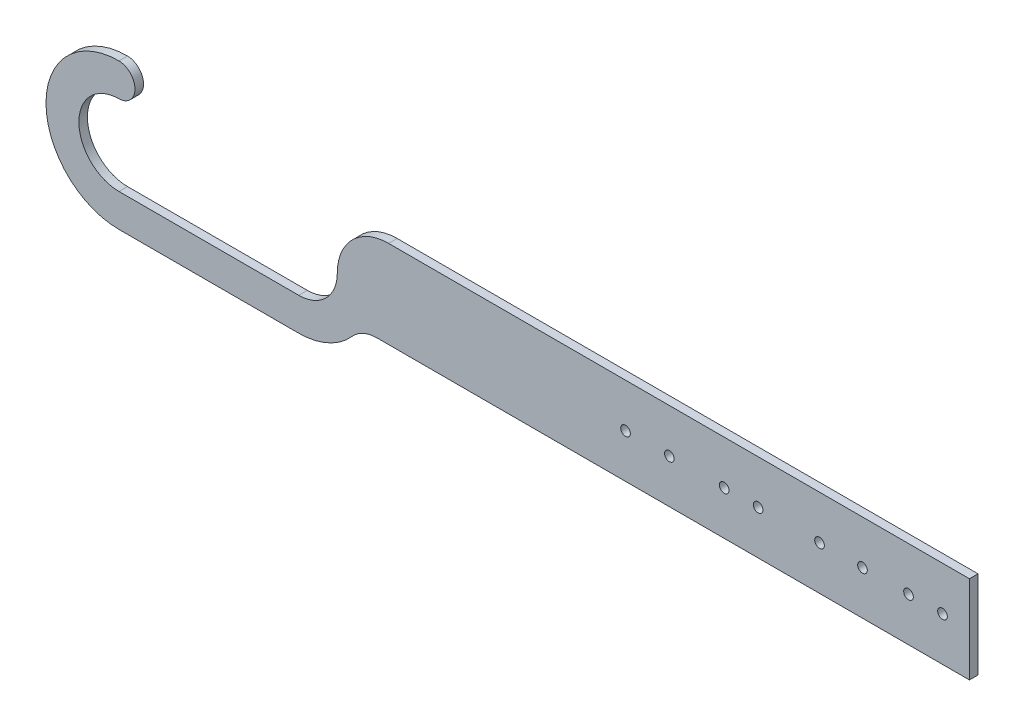
ISO-10303-21;
HEADER;
FILE_DESCRIPTION(('STEP AP214'),'2;1');
FILE_NAME('part.step','',(''),(''),'','','');
FILE_SCHEMA(('AUTOMOTIVE_DESIGN { 1 0 10303 214 1 1 1 1 }'));
ENDSEC;
DATA;
#1=APPLICATION_CONTEXT('core data for automotive mechanical design processes');
#2=APPLICATION_PROTOCOL_DEFINITION('international standard','automotive_design',2000,#1);
#3=PRODUCT_CONTEXT('',#1,'mechanical');
#4=PRODUCT('Part','Part','',(#3));
#5=PRODUCT_RELATED_PRODUCT_CATEGORY('part','',(#4));
#6=PRODUCT_DEFINITION_FORMATION('','',#4);
#7=PRODUCT_DEFINITION_CONTEXT('part definition',#1,'design');
#8=PRODUCT_DEFINITION('design','',#6,#7);
#9=PRODUCT_DEFINITION_SHAPE('','',#8);
#10=(LENGTH_UNIT() NAMED_UNIT(*) SI_UNIT(.MILLI.,.METRE.));
#11=(NAMED_UNIT(*) PLANE_ANGLE_UNIT() SI_UNIT($,.RADIAN.));
#12=(NAMED_UNIT(*) SI_UNIT($,.STERADIAN.) SOLID_ANGLE_UNIT());
#13=UNCERTAINTY_MEASURE_WITH_UNIT(LENGTH_MEASURE(1.E-05),#10,'distance_accuracy_value','');
#14=(GEOMETRIC_REPRESENTATION_CONTEXT(3) GLOBAL_UNCERTAINTY_ASSIGNED_CONTEXT((#13)) GLOBAL_UNIT_ASSIGNED_CONTEXT((#10,
#11,#12)) REPRESENTATION_CONTEXT('',''));
#15=CARTESIAN_POINT('',(0.,0.,0.));
#16=DIRECTION('',(0.,0.,1.));
#17=DIRECTION('',(1.,0.,0.));
#18=AXIS2_PLACEMENT_3D('',#15,#16,#17);
#19=CARTESIAN_POINT('',(0.,-12.5655772297577,4.953));
#20=DIRECTION('',(0.,-1.,0.));
#21=DIRECTION('',(1.,0.,0.));
#22=AXIS2_PLACEMENT_3D('',#19,#20,#21);
#23=PLANE('',#22);
#24=DIRECTION('',(0.,0.,-1.));
#25=VECTOR('',#24,1.);
#26=CARTESIAN_POINT('',(-48.3700595149993,-12.5655772297577,4.953));
#27=LINE('',#26,#25);
#28=CARTESIAN_POINT('',(-48.3700595149993,-12.5655772297577,4.953));
#29=VERTEX_POINT('',#28);
#30=CARTESIAN_POINT('',(-48.3700595149993,-12.5655772297577,0.));
#31=VERTEX_POINT('',#30);
#32=EDGE_CURVE('E63',#29,#31,#27,.T.);
#33=ORIENTED_EDGE('',*,*,#32,.T.);
#34=DIRECTION('',(-1.,0.,0.));
#35=VECTOR('',#34,1.);
#36=CARTESIAN_POINT('',(0.,-12.5655772297577,0.));
#37=LINE('',#36,#35);
#38=CARTESIAN_POINT('',(295.040794507666,-12.5655772297577,0.));
#39=VERTEX_POINT('',#38);
#40=EDGE_CURVE('E216',#39,#31,#37,.T.);
#41=ORIENTED_EDGE('',*,*,#40,.F.);
#42=DIRECTION('',(0.,0.,-1.));
#43=VECTOR('',#42,1.);
#44=CARTESIAN_POINT('',(295.040794507666,-12.5655772297577,4.953));
#45=LINE('',#44,#43);
#46=CARTESIAN_POINT('',(295.040794507666,-12.5655772297577,4.953));
#47=VERTEX_POINT('',#46);
#48=EDGE_CURVE('E11',#47,#39,#45,.T.);
#49=ORIENTED_EDGE('',*,*,#48,.F.);
#50=DIRECTION('',(-1.,0.,0.));
#51=VECTOR('',#50,1.);
#52=CARTESIAN_POINT('',(0.,-12.5655772297577,4.953));
#53=LINE('',#52,#51);
#54=EDGE_CURVE('E56',#47,#29,#53,.T.);
#55=ORIENTED_EDGE('',*,*,#54,.T.);
#56=EDGE_LOOP('',(#33,#41,#49,#55));
#57=FACE_BOUND('',#56,.T.);
#58=ADVANCED_FACE('F39',(#57),#23,.T.);
#59=CARTESIAN_POINT('',(295.040794507666,0.,4.953));
#60=DIRECTION('',(1.,0.,0.));
#61=DIRECTION('',(0.,0.,-1.));
#62=AXIS2_PLACEMENT_3D('',#59,#60,#61);
#63=PLANE('',#62);
#64=DIRECTION('',(0.,-1.,0.));
#65=VECTOR('',#64,1.);
#66=CARTESIAN_POINT('',(295.040794507666,0.,0.));
#67=LINE('',#66,#65);
#68=CARTESIAN_POINT('',(295.040794507666,38.2344227702423,0.));
#69=VERTEX_POINT('',#68);
#70=EDGE_CURVE('E250',#69,#39,#67,.T.);
#71=ORIENTED_EDGE('',*,*,#70,.F.);
#72=DIRECTION('',(0.,0.,-1.));
#73=VECTOR('',#72,1.);
#74=CARTESIAN_POINT('',(295.040794507666,38.2344227702423,4.953));
#75=LINE('',#74,#73);
#76=CARTESIAN_POINT('',(295.040794507666,38.2344227702423,4.953));
#77=VERTEX_POINT('',#76);
#78=EDGE_CURVE('E46',#77,#69,#75,.T.);
#79=ORIENTED_EDGE('',*,*,#78,.F.);
#80=DIRECTION('',(0.,-1.,0.));
#81=VECTOR('',#80,1.);
#82=CARTESIAN_POINT('',(295.040794507666,0.,4.953));
#83=LINE('',#82,#81);
#84=EDGE_CURVE('E236',#77,#47,#83,.T.);
#85=ORIENTED_EDGE('',*,*,#84,.T.);
#86=ORIENTED_EDGE('',*,*,#48,.T.);
#87=EDGE_LOOP('',(#71,#79,#85,#86));
#88=FACE_BOUND('',#87,.T.);
#89=ADVANCED_FACE('F271',(#88),#63,.T.);
#90=CARTESIAN_POINT('',(0.,38.2344227702423,4.953));
#91=DIRECTION('',(0.,1.,0.));
#92=DIRECTION('',(0.,0.,1.));
#93=AXIS2_PLACEMENT_3D('',#90,#91,#92);
#94=PLANE('',#93);
#95=DIRECTION('',(1.,0.,0.));
#96=VECTOR('',#95,1.);
#97=CARTESIAN_POINT('',(0.,38.2344227702423,0.));
#98=LINE('',#97,#96);
#99=CARTESIAN_POINT('',(-41.5092054923345,38.2344227702423,0.));
#100=VERTEX_POINT('',#99);
#101=EDGE_CURVE('E253',#100,#69,#98,.T.);
#102=ORIENTED_EDGE('',*,*,#101,.F.);
#103=DIRECTION('',(0.,0.,-1.));
#104=VECTOR('',#103,1.);
#105=CARTESIAN_POINT('',(-41.5092054923345,38.2344227702423,4.953));
#106=LINE('',#105,#104);
#107=CARTESIAN_POINT('',(-41.5092054923345,38.2344227702423,4.953));
#108=VERTEX_POINT('',#107);
#109=EDGE_CURVE('E262',#108,#100,#106,.T.);
#110=ORIENTED_EDGE('',*,*,#109,.F.);
#111=DIRECTION('',(1.,0.,0.));
#112=VECTOR('',#111,1.);
#113=CARTESIAN_POINT('',(0.,38.2344227702423,4.953));
#114=LINE('',#113,#112);
#115=EDGE_CURVE('E240',#108,#77,#114,.T.);
#116=ORIENTED_EDGE('',*,*,#115,.T.);
#117=ORIENTED_EDGE('',*,*,#78,.T.);
#118=EDGE_LOOP('',(#102,#110,#116,#117));
#119=FACE_BOUND('',#118,.T.);
#120=ADVANCED_FACE('F267',(#119),#94,.T.);
#121=CARTESIAN_POINT('',(-41.5092054923345,8.5164227702423,4.953));
#122=DIRECTION('',(0.,0.,-1.));
#123=DIRECTION('',(-1.,0.,0.));
#124=AXIS2_PLACEMENT_3D('',#121,#122,#123);
#125=CYLINDRICAL_SURFACE('',#124,29.718);
#126=CARTESIAN_POINT('',(-41.5092054923345,8.5164227702423,0.));
#127=DIRECTION('',(0.,0.,1.));
#128=DIRECTION('',(1.,0.,0.));
#129=AXIS2_PLACEMENT_3D('',#126,#127,#128);
#130=CIRCLE('',#129,29.718);
#131=CARTESIAN_POINT('',(-71.2272054923345,8.5164227702423,0.));
#132=VERTEX_POINT('',#131);
#133=EDGE_CURVE('E237',#100,#132,#130,.T.);
#134=ORIENTED_EDGE('',*,*,#133,.T.);
#135=DIRECTION('',(0.,0.,-1.));
#136=VECTOR('',#135,1.);
#137=CARTESIAN_POINT('',(-71.2272054923345,8.5164227702423,4.953));
#138=LINE('',#137,#136);
#139=CARTESIAN_POINT('',(-71.2272054923345,8.5164227702423,4.953));
#140=VERTEX_POINT('',#139);
#141=EDGE_CURVE('E247',#140,#132,#138,.T.);
#142=ORIENTED_EDGE('',*,*,#141,.F.);
#143=CARTESIAN_POINT('',(-41.5092054923345,8.5164227702423,4.953));
#144=DIRECTION('',(0.,0.,1.));
#145=DIRECTION('',(1.,0.,0.));
#146=AXIS2_PLACEMENT_3D('',#143,#144,#145);
#147=CIRCLE('',#146,29.718);
#148=EDGE_CURVE('E244',#108,#140,#147,.T.);
#149=ORIENTED_EDGE('',*,*,#148,.F.);
#150=ORIENTED_EDGE('',*,*,#109,.T.);
#151=EDGE_LOOP('',(#134,#142,#149,#150));
#152=FACE_BOUND('',#151,.T.);
#153=ADVANCED_FACE('F279',(#152),#125,.T.);
#154=CARTESIAN_POINT('',(0.,0.,4.953));
#155=DIRECTION('',(0.,0.,1.));
#156=DIRECTION('',(1.,0.,0.));
#157=AXIS2_PLACEMENT_3D('',#154,#155,#156);
#158=PLANE('',#157);
#159=CARTESIAN_POINT('',(95.7777945076655,12.8344227702423,4.953));
#160=DIRECTION('',(0.,0.,-1.));
#161=DIRECTION('',(-1.,0.,0.));
#162=AXIS2_PLACEMENT_3D('',#159,#160,#161);
#163=CIRCLE('',#162,2.794);
#164=CARTESIAN_POINT('',(92.9837945076655,12.8344227702423,4.953));
#165=VERTEX_POINT('',#164);
#166=EDGE_CURVE('E371',#165,#165,#163,.T.);
#167=ORIENTED_EDGE('',*,*,#166,.T.);
#168=EDGE_LOOP('',(#167));
#169=FACE_BOUND('',#168,.T.);
#170=CARTESIAN_POINT('',(121.177794507666,12.8344227702423,4.953));
#171=DIRECTION('',(0.,0.,-1.));
#172=DIRECTION('',(-1.,0.,0.));
#173=AXIS2_PLACEMENT_3D('',#170,#171,#172);
#174=CIRCLE('',#173,2.79400000000001);
#175=CARTESIAN_POINT('',(118.383794507666,12.8344227702423,4.953));
#176=VERTEX_POINT('',#175);
#177=EDGE_CURVE('E379',#176,#176,#174,.T.);
#178=ORIENTED_EDGE('',*,*,#177,.T.);
#179=EDGE_LOOP('',(#178));
#180=FACE_BOUND('',#179,.T.);
#181=CARTESIAN_POINT('',(152.927794507666,12.8344227702423,4.953));
#182=DIRECTION('',(0.,0.,-1.));
#183=DIRECTION('',(-1.,0.,0.));
#184=AXIS2_PLACEMENT_3D('',#181,#182,#183);
#185=CIRCLE('',#184,2.79399999999998);
#186=CARTESIAN_POINT('',(150.133794507666,12.8344227702423,4.953));
#187=VERTEX_POINT('',#186);
#188=EDGE_CURVE('E385',#187,#187,#185,.T.);
#189=ORIENTED_EDGE('',*,*,#188,.T.);
#190=EDGE_LOOP('',(#189));
#191=FACE_BOUND('',#190,.T.);
#192=CARTESIAN_POINT('',(172.612794507666,12.8344227702423,4.953));
#193=DIRECTION('',(0.,0.,-1.));
#194=DIRECTION('',(-1.,0.,0.));
#195=AXIS2_PLACEMENT_3D('',#192,#193,#194);
#196=CIRCLE('',#195,2.79399999999998);
#197=CARTESIAN_POINT('',(169.818794507666,12.8344227702423,4.953));
#198=VERTEX_POINT('',#197);
#199=EDGE_CURVE('E391',#198,#198,#196,.T.);
#200=ORIENTED_EDGE('',*,*,#199,.T.);
#201=EDGE_LOOP('',(#200));
#202=FACE_BOUND('',#201,.T.);
#203=CARTESIAN_POINT('',(208.172794507666,12.8344227702423,4.953));
#204=DIRECTION('',(0.,0.,-1.));
#205=DIRECTION('',(-1.,0.,0.));
#206=AXIS2_PLACEMENT_3D('',#203,#204,#205);
#207=CIRCLE('',#206,2.79400000000001);
#208=CARTESIAN_POINT('',(205.378794507666,12.8344227702423,4.953));
#209=VERTEX_POINT('',#208);
#210=EDGE_CURVE('E397',#209,#209,#207,.T.);
#211=ORIENTED_EDGE('',*,*,#210,.T.);
#212=EDGE_LOOP('',(#211));
#213=FACE_BOUND('',#212,.T.);
#214=CARTESIAN_POINT('',(233.064794507666,12.8344227702423,4.953));
#215=DIRECTION('',(0.,0.,-1.));
#216=DIRECTION('',(-1.,0.,0.));
#217=AXIS2_PLACEMENT_3D('',#214,#215,#216);
#218=CIRCLE('',#217,2.79400000000001);
#219=CARTESIAN_POINT('',(230.270794507665,12.8344227702423,4.953));
#220=VERTEX_POINT('',#219);
#221=EDGE_CURVE('E403',#220,#220,#218,.T.);
#222=ORIENTED_EDGE('',*,*,#221,.T.);
#223=EDGE_LOOP('',(#222));
#224=FACE_BOUND('',#223,.T.);
#225=CARTESIAN_POINT('',(259.734794507666,12.8344227702423,4.953));
#226=DIRECTION('',(0.,0.,-1.));
#227=DIRECTION('',(-1.,0.,0.));
#228=AXIS2_PLACEMENT_3D('',#225,#226,#227);
#229=CIRCLE('',#228,2.79399999999998);
#230=CARTESIAN_POINT('',(256.940794507666,12.8344227702423,4.953));
#231=VERTEX_POINT('',#230);
#232=EDGE_CURVE('E409',#231,#231,#229,.T.);
#233=ORIENTED_EDGE('',*,*,#232,.T.);
#234=EDGE_LOOP('',(#233));
#235=FACE_BOUND('',#234,.T.);
#236=CARTESIAN_POINT('',(279.419794507666,12.8344227702423,4.953));
#237=DIRECTION('',(0.,0.,-1.));
#238=DIRECTION('',(-1.,0.,0.));
#239=AXIS2_PLACEMENT_3D('',#236,#237,#238);
#240=CIRCLE('',#239,2.79399999999998);
#241=CARTESIAN_POINT('',(276.625794507666,12.8344227702423,4.953));
#242=VERTEX_POINT('',#241);
#243=EDGE_CURVE('E195',#242,#242,#240,.T.);
#244=ORIENTED_EDGE('',*,*,#243,.T.);
#245=EDGE_LOOP('',(#244));
#246=FACE_BOUND('',#245,.T.);
#247=ORIENTED_EDGE('',*,*,#54,.F.);
#248=ORIENTED_EDGE('',*,*,#84,.F.);
#249=ORIENTED_EDGE('',*,*,#115,.F.);
#250=ORIENTED_EDGE('',*,*,#148,.T.);
#251=CARTESIAN_POINT('',(-93.5792054923345,8.5164227702423,4.953));
#252=DIRECTION('',(0.,0.,-1.));
#253=DIRECTION('',(-1.,0.,0.));
#254=AXIS2_PLACEMENT_3D('',#251,#252,#253);
#255=CIRCLE('',#254,22.352);
#256=CARTESIAN_POINT('',(-93.5792054923345,-13.8355772297577,4.953));
#257=VERTEX_POINT('',#256);
#258=EDGE_CURVE('E180',#140,#257,#255,.T.);
#259=ORIENTED_EDGE('',*,*,#258,.T.);
#260=DIRECTION('',(-1.,0.,0.));
#261=VECTOR('',#260,1.);
#262=CARTESIAN_POINT('',(0.,-13.8355772297577,4.953));
#263=LINE('',#262,#261);
#264=CARTESIAN_POINT('',(-197.719205492334,-13.8355772297577,4.953));
#265=VERTEX_POINT('',#264);
#266=EDGE_CURVE('E177',#257,#265,#263,.T.);
#267=ORIENTED_EDGE('',*,*,#266,.T.);
#268=CARTESIAN_POINT('',(-197.719205492335,9.40617731443868,4.953));
#269=DIRECTION('',(0.,0.,-1.));
#270=DIRECTION('',(-1.,0.,0.));
#271=AXIS2_PLACEMENT_3D('',#268,#269,#270);
#272=CIRCLE('',#271,23.2417545441964);
#273=CARTESIAN_POINT('',(-197.719205492334,32.6479318586351,4.953));
#274=VERTEX_POINT('',#273);
#275=EDGE_CURVE('E159',#265,#274,#272,.T.);
#276=ORIENTED_EDGE('',*,*,#275,.T.);
#277=CARTESIAN_POINT('',(-197.979885508068,42.1729318586351,4.953));
#278=DIRECTION('',(0.,0.,-1.));
#279=DIRECTION('',(-1.,0.,0.));
#280=AXIS2_PLACEMENT_3D('',#277,#278,#279);
#281=CIRCLE('',#280,9.52856647511071);
#282=CARTESIAN_POINT('',(-197.719205492334,51.6979318586351,4.953));
#283=VERTEX_POINT('',#282);
#284=EDGE_CURVE('E142',#283,#274,#281,.T.);
#285=ORIENTED_EDGE('',*,*,#284,.F.);
#286=CARTESIAN_POINT('',(-197.719205492335,9.40617731443868,4.953));
#287=DIRECTION('',(0.,0.,-1.));
#288=DIRECTION('',(-1.,0.,0.));
#289=AXIS2_PLACEMENT_3D('',#286,#287,#288);
#290=CIRCLE('',#289,42.2917545441964);
#291=CARTESIAN_POINT('',(-197.719205492334,-32.8855772297577,4.953));
#292=VERTEX_POINT('',#291);
#293=EDGE_CURVE('E156',#292,#283,#290,.T.);
#294=ORIENTED_EDGE('',*,*,#293,.F.);
#295=DIRECTION('',(-1.,0.,0.));
#296=VECTOR('',#295,1.);
#297=CARTESIAN_POINT('',(0.,-32.8855772297577,4.953));
#298=LINE('',#297,#296);
#299=CARTESIAN_POINT('',(-93.5792054923345,-32.8855772297577,4.953));
#300=VERTEX_POINT('',#299);
#301=EDGE_CURVE('E150',#300,#292,#298,.T.);
#302=ORIENTED_EDGE('',*,*,#301,.F.);
#303=CARTESIAN_POINT('',(-93.5792054923345,8.5164227702423,4.953));
#304=DIRECTION('',(0.,0.,-1.));
#305=DIRECTION('',(-1.,0.,0.));
#306=AXIS2_PLACEMENT_3D('',#303,#304,#305);
#307=CIRCLE('',#306,41.402);
#308=CARTESIAN_POINT('',(-62.6166391297058,-18.9689385742955,4.953));
#309=VERTEX_POINT('',#308);
#310=EDGE_CURVE('E187',#309,#300,#307,.T.);
#311=ORIENTED_EDGE('',*,*,#310,.F.);
#312=CARTESIAN_POINT('',(-48.3700595149993,-31.6155772297577,4.953));
#313=DIRECTION('',(0.,0.,-1.));
#314=DIRECTION('',(-1.,0.,0.));
#315=AXIS2_PLACEMENT_3D('',#312,#313,#314);
#316=CIRCLE('',#315,19.05);
#317=EDGE_CURVE('E183',#29,#309,#316,.F.);
#318=ORIENTED_EDGE('',*,*,#317,.F.);
#319=EDGE_LOOP('',(#247,#248,#249,#250,#259,#267,#276,#285,#294,#302,#311,#318));
#320=FACE_BOUND('',#319,.T.);
#321=ADVANCED_FACE('F154',(#169,#180,#191,#202,#213,#224,#235,#246,#320),#158,.T.);
#322=CARTESIAN_POINT('',(0.,0.,0.));
#323=DIRECTION('',(0.,0.,1.));
#324=DIRECTION('',(1.,0.,0.));
#325=AXIS2_PLACEMENT_3D('',#322,#323,#324);
#326=PLANE('',#325);
#327=CARTESIAN_POINT('',(95.7777945076655,12.8344227702423,0.));
#328=DIRECTION('',(0.,0.,-1.));
#329=DIRECTION('',(-1.,0.,0.));
#330=AXIS2_PLACEMENT_3D('',#327,#328,#329);
#331=CIRCLE('',#330,2.794);
#332=CARTESIAN_POINT('',(92.9837945076655,12.8344227702423,0.));
#333=VERTEX_POINT('',#332);
#334=EDGE_CURVE('E374',#333,#333,#331,.T.);
#335=ORIENTED_EDGE('',*,*,#334,.F.);
#336=EDGE_LOOP('',(#335));
#337=FACE_BOUND('',#336,.T.);
#338=CARTESIAN_POINT('',(121.177794507666,12.8344227702423,0.));
#339=DIRECTION('',(0.,0.,-1.));
#340=DIRECTION('',(-1.,0.,0.));
#341=AXIS2_PLACEMENT_3D('',#338,#339,#340);
#342=CIRCLE('',#341,2.79400000000001);
#343=CARTESIAN_POINT('',(118.383794507666,12.8344227702423,0.));
#344=VERTEX_POINT('',#343);
#345=EDGE_CURVE('E376',#344,#344,#342,.T.);
#346=ORIENTED_EDGE('',*,*,#345,.F.);
#347=EDGE_LOOP('',(#346));
#348=FACE_BOUND('',#347,.T.);
#349=CARTESIAN_POINT('',(152.927794507666,12.8344227702423,0.));
#350=DIRECTION('',(0.,0.,-1.));
#351=DIRECTION('',(-1.,0.,0.));
#352=AXIS2_PLACEMENT_3D('',#349,#350,#351);
#353=CIRCLE('',#352,2.79399999999998);
#354=CARTESIAN_POINT('',(150.133794507666,12.8344227702423,0.));
#355=VERTEX_POINT('',#354);
#356=EDGE_CURVE('E382',#355,#355,#353,.T.);
#357=ORIENTED_EDGE('',*,*,#356,.F.);
#358=EDGE_LOOP('',(#357));
#359=FACE_BOUND('',#358,.T.);
#360=CARTESIAN_POINT('',(172.612794507666,12.8344227702423,0.));
#361=DIRECTION('',(0.,0.,-1.));
#362=DIRECTION('',(-1.,0.,0.));
#363=AXIS2_PLACEMENT_3D('',#360,#361,#362);
#364=CIRCLE('',#363,2.79399999999998);
#365=CARTESIAN_POINT('',(169.818794507666,12.8344227702423,0.));
#366=VERTEX_POINT('',#365);
#367=EDGE_CURVE('E388',#366,#366,#364,.T.);
#368=ORIENTED_EDGE('',*,*,#367,.F.);
#369=EDGE_LOOP('',(#368));
#370=FACE_BOUND('',#369,.T.);
#371=CARTESIAN_POINT('',(208.172794507666,12.8344227702423,0.));
#372=DIRECTION('',(0.,0.,-1.));
#373=DIRECTION('',(-1.,0.,0.));
#374=AXIS2_PLACEMENT_3D('',#371,#372,#373);
#375=CIRCLE('',#374,2.79400000000001);
#376=CARTESIAN_POINT('',(205.378794507666,12.8344227702423,0.));
#377=VERTEX_POINT('',#376);
#378=EDGE_CURVE('E394',#377,#377,#375,.T.);
#379=ORIENTED_EDGE('',*,*,#378,.F.);
#380=EDGE_LOOP('',(#379));
#381=FACE_BOUND('',#380,.T.);
#382=CARTESIAN_POINT('',(233.064794507666,12.8344227702423,0.));
#383=DIRECTION('',(0.,0.,-1.));
#384=DIRECTION('',(-1.,0.,0.));
#385=AXIS2_PLACEMENT_3D('',#382,#383,#384);
#386=CIRCLE('',#385,2.79400000000001);
#387=CARTESIAN_POINT('',(230.270794507665,12.8344227702423,0.));
#388=VERTEX_POINT('',#387);
#389=EDGE_CURVE('E400',#388,#388,#386,.T.);
#390=ORIENTED_EDGE('',*,*,#389,.F.);
#391=EDGE_LOOP('',(#390));
#392=FACE_BOUND('',#391,.T.);
#393=CARTESIAN_POINT('',(259.734794507666,12.8344227702423,0.));
#394=DIRECTION('',(0.,0.,-1.));
#395=DIRECTION('',(-1.,0.,0.));
#396=AXIS2_PLACEMENT_3D('',#393,#394,#395);
#397=CIRCLE('',#396,2.79399999999998);
#398=CARTESIAN_POINT('',(256.940794507666,12.8344227702423,0.));
#399=VERTEX_POINT('',#398);
#400=EDGE_CURVE('E406',#399,#399,#397,.T.);
#401=ORIENTED_EDGE('',*,*,#400,.F.);
#402=EDGE_LOOP('',(#401));
#403=FACE_BOUND('',#402,.T.);
#404=CARTESIAN_POINT('',(279.419794507666,12.8344227702423,0.));
#405=DIRECTION('',(0.,0.,-1.));
#406=DIRECTION('',(-1.,0.,0.));
#407=AXIS2_PLACEMENT_3D('',#404,#405,#406);
#408=CIRCLE('',#407,2.79399999999998);
#409=CARTESIAN_POINT('',(276.625794507666,12.8344227702423,0.));
#410=VERTEX_POINT('',#409);
#411=EDGE_CURVE('E172',#410,#410,#408,.T.);
#412=ORIENTED_EDGE('',*,*,#411,.F.);
#413=EDGE_LOOP('',(#412));
#414=FACE_BOUND('',#413,.T.);
#415=ORIENTED_EDGE('',*,*,#40,.T.);
#416=CARTESIAN_POINT('',(-48.3700595149993,-31.6155772297577,0.));
#417=DIRECTION('',(0.,0.,-1.));
#418=DIRECTION('',(-1.,0.,0.));
#419=AXIS2_PLACEMENT_3D('',#416,#417,#418);
#420=CIRCLE('',#419,19.05);
#421=CARTESIAN_POINT('',(-62.6166391297058,-18.9689385742955,0.));
#422=VERTEX_POINT('',#421);
#423=EDGE_CURVE('E208',#31,#422,#420,.F.);
#424=ORIENTED_EDGE('',*,*,#423,.T.);
#425=CARTESIAN_POINT('',(-93.5792054923345,8.5164227702423,0.));
#426=DIRECTION('',(0.,0.,-1.));
#427=DIRECTION('',(-1.,0.,0.));
#428=AXIS2_PLACEMENT_3D('',#425,#426,#427);
#429=CIRCLE('',#428,41.402);
#430=CARTESIAN_POINT('',(-93.5792054923345,-32.8855772297577,0.));
#431=VERTEX_POINT('',#430);
#432=EDGE_CURVE('E169',#422,#431,#429,.T.);
#433=ORIENTED_EDGE('',*,*,#432,.T.);
#434=DIRECTION('',(-1.,0.,0.));
#435=VECTOR('',#434,1.);
#436=CARTESIAN_POINT('',(0.,-32.8855772297577,0.));
#437=LINE('',#436,#435);
#438=CARTESIAN_POINT('',(-197.719205492334,-32.8855772297577,0.));
#439=VERTEX_POINT('',#438);
#440=EDGE_CURVE('E165',#431,#439,#437,.T.);
#441=ORIENTED_EDGE('',*,*,#440,.T.);
#442=CARTESIAN_POINT('',(-197.719205492335,9.40617731443868,0.));
#443=DIRECTION('',(0.,0.,-1.));
#444=DIRECTION('',(-1.,0.,0.));
#445=AXIS2_PLACEMENT_3D('',#442,#443,#444);
#446=CIRCLE('',#445,42.2917545441964);
#447=CARTESIAN_POINT('',(-197.719205492334,51.6979318586351,0.));
#448=VERTEX_POINT('',#447);
#449=EDGE_CURVE('E193',#439,#448,#446,.T.);
#450=ORIENTED_EDGE('',*,*,#449,.T.);
#451=CARTESIAN_POINT('',(-197.979885508068,42.1729318586351,0.));
#452=DIRECTION('',(0.,0.,-1.));
#453=DIRECTION('',(-1.,0.,0.));
#454=AXIS2_PLACEMENT_3D('',#451,#452,#453);
#455=CIRCLE('',#454,9.52856647511071);
#456=CARTESIAN_POINT('',(-197.719205492334,32.6479318586351,0.));
#457=VERTEX_POINT('',#456);
#458=EDGE_CURVE('E144',#448,#457,#455,.T.);
#459=ORIENTED_EDGE('',*,*,#458,.T.);
#460=CARTESIAN_POINT('',(-197.719205492335,9.40617731443868,0.));
#461=DIRECTION('',(0.,0.,-1.));
#462=DIRECTION('',(-1.,0.,0.));
#463=AXIS2_PLACEMENT_3D('',#460,#461,#462);
#464=CIRCLE('',#463,23.2417545441964);
#465=CARTESIAN_POINT('',(-197.719205492334,-13.8355772297577,0.));
#466=VERTEX_POINT('',#465);
#467=EDGE_CURVE('E198',#466,#457,#464,.T.);
#468=ORIENTED_EDGE('',*,*,#467,.F.);
#469=DIRECTION('',(-1.,0.,0.));
#470=VECTOR('',#469,1.);
#471=CARTESIAN_POINT('',(0.,-13.8355772297577,0.));
#472=LINE('',#471,#470);
#473=CARTESIAN_POINT('',(-93.5792054923345,-13.8355772297577,0.));
#474=VERTEX_POINT('',#473);
#475=EDGE_CURVE('E202',#474,#466,#472,.T.);
#476=ORIENTED_EDGE('',*,*,#475,.F.);
#477=CARTESIAN_POINT('',(-93.5792054923345,8.5164227702423,0.));
#478=DIRECTION('',(0.,0.,-1.));
#479=DIRECTION('',(-1.,0.,0.));
#480=AXIS2_PLACEMENT_3D('',#477,#478,#479);
#481=CIRCLE('',#480,22.352);
#482=EDGE_CURVE('E205',#132,#474,#481,.T.);
#483=ORIENTED_EDGE('',*,*,#482,.F.);
#484=ORIENTED_EDGE('',*,*,#133,.F.);
#485=ORIENTED_EDGE('',*,*,#101,.T.);
#486=ORIENTED_EDGE('',*,*,#70,.T.);
#487=EDGE_LOOP('',(#415,#424,#433,#441,#450,#459,#468,#476,#483,#484,#485,#486));
#488=FACE_BOUND('',#487,.T.);
#489=ADVANCED_FACE('F274',(#337,#348,#359,#370,#381,#392,#403,#414,#488),#326,.F.);
#490=CARTESIAN_POINT('',(-197.719205492335,9.40617731443868,4.953));
#491=DIRECTION('',(0.,0.,-1.));
#492=DIRECTION('',(-1.,0.,0.));
#493=AXIS2_PLACEMENT_3D('',#490,#491,#492);
#494=CYLINDRICAL_SURFACE('',#493,42.2917545441964);
#495=ORIENTED_EDGE('',*,*,#449,.F.);
#496=DIRECTION('',(0.,0.,-1.));
#497=VECTOR('',#496,1.);
#498=CARTESIAN_POINT('',(-197.719205492334,-32.8855772297577,4.953));
#499=LINE('',#498,#497);
#500=EDGE_CURVE('E164',#292,#439,#499,.T.);
#501=ORIENTED_EDGE('',*,*,#500,.F.);
#502=ORIENTED_EDGE('',*,*,#293,.T.);
#503=DIRECTION('',(0.,0.,-1.));
#504=VECTOR('',#503,1.);
#505=CARTESIAN_POINT('',(-197.719205492334,51.6979318586351,4.953));
#506=LINE('',#505,#504);
#507=EDGE_CURVE('E139',#283,#448,#506,.T.);
#508=ORIENTED_EDGE('',*,*,#507,.T.);
#509=EDGE_LOOP('',(#495,#501,#502,#508));
#510=FACE_BOUND('',#509,.T.);
#511=ADVANCED_FACE('F163',(#510),#494,.T.);
#512=CARTESIAN_POINT('',(0.,-32.8855772297577,4.953));
#513=DIRECTION('',(0.,-1.,0.));
#514=DIRECTION('',(0.,0.,-1.));
#515=AXIS2_PLACEMENT_3D('',#512,#513,#514);
#516=PLANE('',#515);
#517=ORIENTED_EDGE('',*,*,#440,.F.);
#518=DIRECTION('',(0.,0.,-1.));
#519=VECTOR('',#518,1.);
#520=CARTESIAN_POINT('',(-93.5792054923345,-32.8855772297577,4.953));
#521=LINE('',#520,#519);
#522=EDGE_CURVE('E217',#300,#431,#521,.T.);
#523=ORIENTED_EDGE('',*,*,#522,.F.);
#524=ORIENTED_EDGE('',*,*,#301,.T.);
#525=ORIENTED_EDGE('',*,*,#500,.T.);
#526=EDGE_LOOP('',(#517,#523,#524,#525));
#527=FACE_BOUND('',#526,.T.);
#528=ADVANCED_FACE('F313',(#527),#516,.T.);
#529=CARTESIAN_POINT('',(-93.5792054923345,8.5164227702423,4.953));
#530=DIRECTION('',(0.,0.,-1.));
#531=DIRECTION('',(-1.,0.,0.));
#532=AXIS2_PLACEMENT_3D('',#529,#530,#531);
#533=CYLINDRICAL_SURFACE('',#532,41.402);
#534=ORIENTED_EDGE('',*,*,#432,.F.);
#535=DIRECTION('',(0.,0.,-1.));
#536=VECTOR('',#535,1.);
#537=CARTESIAN_POINT('',(-62.6166391297058,-18.9689385742955,4.953));
#538=LINE('',#537,#536);
#539=EDGE_CURVE('E220',#309,#422,#538,.T.);
#540=ORIENTED_EDGE('',*,*,#539,.F.);
#541=ORIENTED_EDGE('',*,*,#310,.T.);
#542=ORIENTED_EDGE('',*,*,#522,.T.);
#543=EDGE_LOOP('',(#534,#540,#541,#542));
#544=FACE_BOUND('',#543,.T.);
#545=ADVANCED_FACE('F329',(#544),#533,.T.);
#546=CARTESIAN_POINT('',(-48.3700595149993,-31.6155772297577,4.953));
#547=DIRECTION('',(0.,0.,-1.));
#548=DIRECTION('',(-1.,0.,0.));
#549=AXIS2_PLACEMENT_3D('',#546,#547,#548);
#550=CYLINDRICAL_SURFACE('',#549,19.05);
#551=ORIENTED_EDGE('',*,*,#423,.F.);
#552=ORIENTED_EDGE('',*,*,#32,.F.);
#553=ORIENTED_EDGE('',*,*,#317,.T.);
#554=ORIENTED_EDGE('',*,*,#539,.T.);
#555=EDGE_LOOP('',(#551,#552,#553,#554));
#556=FACE_BOUND('',#555,.T.);
#557=ADVANCED_FACE('F291',(#556),#550,.F.);
#558=CARTESIAN_POINT('',(-93.5792054923345,8.5164227702423,4.953));
#559=DIRECTION('',(0.,0.,-1.));
#560=DIRECTION('',(-1.,0.,0.));
#561=AXIS2_PLACEMENT_3D('',#558,#559,#560);
#562=CYLINDRICAL_SURFACE('',#561,22.352);
#563=ORIENTED_EDGE('',*,*,#482,.T.);
#564=DIRECTION('',(0.,0.,-1.));
#565=VECTOR('',#564,1.);
#566=CARTESIAN_POINT('',(-93.5792054923345,-13.8355772297577,4.953));
#567=LINE('',#566,#565);
#568=EDGE_CURVE('E225',#257,#474,#567,.T.);
#569=ORIENTED_EDGE('',*,*,#568,.F.);
#570=ORIENTED_EDGE('',*,*,#258,.F.);
#571=ORIENTED_EDGE('',*,*,#141,.T.);
#572=EDGE_LOOP('',(#563,#569,#570,#571));
#573=FACE_BOUND('',#572,.T.);
#574=ADVANCED_FACE('F283',(#573),#562,.F.);
#575=CARTESIAN_POINT('',(0.,-13.8355772297577,4.953));
#576=DIRECTION('',(0.,-1.,0.));
#577=DIRECTION('',(1.,0.,0.));
#578=AXIS2_PLACEMENT_3D('',#575,#576,#577);
#579=PLANE('',#578);
#580=ORIENTED_EDGE('',*,*,#475,.T.);
#581=DIRECTION('',(0.,0.,-1.));
#582=VECTOR('',#581,1.);
#583=CARTESIAN_POINT('',(-197.719205492334,-13.8355772297577,4.953));
#584=LINE('',#583,#582);
#585=EDGE_CURVE('E229',#265,#466,#584,.T.);
#586=ORIENTED_EDGE('',*,*,#585,.F.);
#587=ORIENTED_EDGE('',*,*,#266,.F.);
#588=ORIENTED_EDGE('',*,*,#568,.T.);
#589=EDGE_LOOP('',(#580,#586,#587,#588));
#590=FACE_BOUND('',#589,.T.);
#591=ADVANCED_FACE('F320',(#590),#579,.F.);
#592=CARTESIAN_POINT('',(-197.719205492335,9.40617731443868,4.953));
#593=DIRECTION('',(0.,0.,-1.));
#594=DIRECTION('',(-1.,0.,0.));
#595=AXIS2_PLACEMENT_3D('',#592,#593,#594);
#596=CYLINDRICAL_SURFACE('',#595,23.2417545441964);
#597=ORIENTED_EDGE('',*,*,#467,.T.);
#598=DIRECTION('',(0.,0.,-1.));
#599=VECTOR('',#598,1.);
#600=CARTESIAN_POINT('',(-197.719205492334,32.6479318586351,4.953));
#601=LINE('',#600,#599);
#602=EDGE_CURVE('E149',#274,#457,#601,.T.);
#603=ORIENTED_EDGE('',*,*,#602,.F.);
#604=ORIENTED_EDGE('',*,*,#275,.F.);
#605=ORIENTED_EDGE('',*,*,#585,.T.);
#606=EDGE_LOOP('',(#597,#603,#604,#605));
#607=FACE_BOUND('',#606,.T.);
#608=ADVANCED_FACE('F317',(#607),#596,.F.);
#609=CARTESIAN_POINT('',(-197.979885508068,42.1729318586351,4.953));
#610=DIRECTION('',(0.,0.,-1.));
#611=DIRECTION('',(-1.,0.,0.));
#612=AXIS2_PLACEMENT_3D('',#609,#610,#611);
#613=CYLINDRICAL_SURFACE('',#612,9.52856647511071);
#614=ORIENTED_EDGE('',*,*,#458,.F.);
#615=ORIENTED_EDGE('',*,*,#507,.F.);
#616=ORIENTED_EDGE('',*,*,#284,.T.);
#617=ORIENTED_EDGE('',*,*,#602,.T.);
#618=EDGE_LOOP('',(#614,#615,#616,#617));
#619=FACE_BOUND('',#618,.T.);
#620=ADVANCED_FACE('F141',(#619),#613,.T.);
#621=CARTESIAN_POINT('',(279.419794507666,12.8344227702423,4.953));
#622=DIRECTION('',(0.,0.,-1.));
#623=DIRECTION('',(-1.,0.,0.));
#624=AXIS2_PLACEMENT_3D('',#621,#622,#623);
#625=CYLINDRICAL_SURFACE('',#624,2.79399999999998);
#626=ORIENTED_EDGE('',*,*,#243,.F.);
#627=EDGE_LOOP('',(#626));
#628=FACE_BOUND('',#627,.T.);
#629=ORIENTED_EDGE('',*,*,#411,.T.);
#630=EDGE_LOOP('',(#629));
#631=FACE_BOUND('',#630,.T.);
#632=ADVANCED_FACE('F316',(#628,#631),#625,.F.);
#633=CARTESIAN_POINT('',(259.734794507666,12.8344227702423,4.953));
#634=DIRECTION('',(0.,0.,-1.));
#635=DIRECTION('',(-1.,0.,0.));
#636=AXIS2_PLACEMENT_3D('',#633,#634,#635);
#637=CYLINDRICAL_SURFACE('',#636,2.79399999999998);
#638=ORIENTED_EDGE('',*,*,#232,.F.);
#639=EDGE_LOOP('',(#638));
#640=FACE_BOUND('',#639,.T.);
#641=ORIENTED_EDGE('',*,*,#400,.T.);
#642=EDGE_LOOP('',(#641));
#643=FACE_BOUND('',#642,.T.);
#644=ADVANCED_FACE('F338',(#640,#643),#637,.F.);
#645=CARTESIAN_POINT('',(233.064794507666,12.8344227702423,4.953));
#646=DIRECTION('',(0.,0.,-1.));
#647=DIRECTION('',(-1.,0.,0.));
#648=AXIS2_PLACEMENT_3D('',#645,#646,#647);
#649=CYLINDRICAL_SURFACE('',#648,2.79400000000001);
#650=ORIENTED_EDGE('',*,*,#221,.F.);
#651=EDGE_LOOP('',(#650));
#652=FACE_BOUND('',#651,.T.);
#653=ORIENTED_EDGE('',*,*,#389,.T.);
#654=EDGE_LOOP('',(#653));
#655=FACE_BOUND('',#654,.T.);
#656=ADVANCED_FACE('F342',(#652,#655),#649,.F.);
#657=CARTESIAN_POINT('',(208.172794507666,12.8344227702423,4.953));
#658=DIRECTION('',(0.,0.,-1.));
#659=DIRECTION('',(-1.,0.,0.));
#660=AXIS2_PLACEMENT_3D('',#657,#658,#659);
#661=CYLINDRICAL_SURFACE('',#660,2.79400000000001);
#662=ORIENTED_EDGE('',*,*,#210,.F.);
#663=EDGE_LOOP('',(#662));
#664=FACE_BOUND('',#663,.T.);
#665=ORIENTED_EDGE('',*,*,#378,.T.);
#666=EDGE_LOOP('',(#665));
#667=FACE_BOUND('',#666,.T.);
#668=ADVANCED_FACE('F346',(#664,#667),#661,.F.);
#669=CARTESIAN_POINT('',(172.612794507666,12.8344227702423,4.953));
#670=DIRECTION('',(0.,0.,-1.));
#671=DIRECTION('',(-1.,0.,0.));
#672=AXIS2_PLACEMENT_3D('',#669,#670,#671);
#673=CYLINDRICAL_SURFACE('',#672,2.79399999999998);
#674=ORIENTED_EDGE('',*,*,#199,.F.);
#675=EDGE_LOOP('',(#674));
#676=FACE_BOUND('',#675,.T.);
#677=ORIENTED_EDGE('',*,*,#367,.T.);
#678=EDGE_LOOP('',(#677));
#679=FACE_BOUND('',#678,.T.);
#680=ADVANCED_FACE('F350',(#676,#679),#673,.F.);
#681=CARTESIAN_POINT('',(152.927794507666,12.8344227702423,4.953));
#682=DIRECTION('',(0.,0.,-1.));
#683=DIRECTION('',(-1.,0.,0.));
#684=AXIS2_PLACEMENT_3D('',#681,#682,#683);
#685=CYLINDRICAL_SURFACE('',#684,2.79399999999998);
#686=ORIENTED_EDGE('',*,*,#188,.F.);
#687=EDGE_LOOP('',(#686));
#688=FACE_BOUND('',#687,.T.);
#689=ORIENTED_EDGE('',*,*,#356,.T.);
#690=EDGE_LOOP('',(#689));
#691=FACE_BOUND('',#690,.T.);
#692=ADVANCED_FACE('F354',(#688,#691),#685,.F.);
#693=CARTESIAN_POINT('',(121.177794507666,12.8344227702423,4.953));
#694=DIRECTION('',(0.,0.,-1.));
#695=DIRECTION('',(-1.,0.,0.));
#696=AXIS2_PLACEMENT_3D('',#693,#694,#695);
#697=CYLINDRICAL_SURFACE('',#696,2.79400000000001);
#698=ORIENTED_EDGE('',*,*,#177,.F.);
#699=EDGE_LOOP('',(#698));
#700=FACE_BOUND('',#699,.T.);
#701=ORIENTED_EDGE('',*,*,#345,.T.);
#702=EDGE_LOOP('',(#701));
#703=FACE_BOUND('',#702,.T.);
#704=ADVANCED_FACE('F358',(#700,#703),#697,.F.);
#705=CARTESIAN_POINT('',(95.7777945076655,12.8344227702423,4.953));
#706=DIRECTION('',(0.,0.,-1.));
#707=DIRECTION('',(-1.,0.,0.));
#708=AXIS2_PLACEMENT_3D('',#705,#706,#707);
#709=CYLINDRICAL_SURFACE('',#708,2.794);
#710=ORIENTED_EDGE('',*,*,#166,.F.);
#711=EDGE_LOOP('',(#710));
#712=FACE_BOUND('',#711,.T.);
#713=ORIENTED_EDGE('',*,*,#334,.T.);
#714=EDGE_LOOP('',(#713));
#715=FACE_BOUND('',#714,.T.);
#716=ADVANCED_FACE('F362',(#712,#715),#709,.F.);
#717=CLOSED_SHELL('',(#58,#89,#120,#153,#321,#489,#511,#528,#545,#557,#574,#591,#608,#620,#632,
#644,#656,#668,#680,#692,#704,#716));
#718=MANIFOLD_SOLID_BREP('B2',#717);
#719=ADVANCED_BREP_SHAPE_REPRESENTATION('',(#18,#718),#14);
#720=SHAPE_DEFINITION_REPRESENTATION(#9,#719);
ENDSEC;
END-ISO-10303-21;
